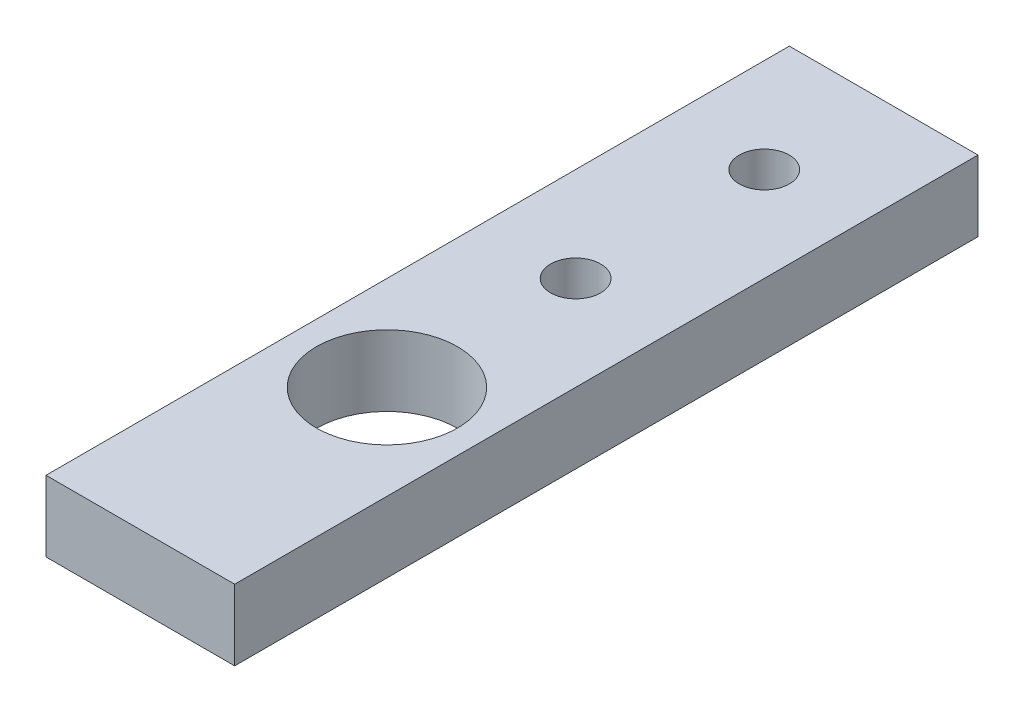
ISO-10303-21;
HEADER;
FILE_DESCRIPTION(('STEP AP214'),'2;1');
FILE_NAME('part.step','',(''),(''),'','','');
FILE_SCHEMA(('AUTOMOTIVE_DESIGN { 1 0 10303 214 1 1 1 1 }'));
ENDSEC;
DATA;
#1=APPLICATION_CONTEXT('core data for automotive mechanical design processes');
#2=APPLICATION_PROTOCOL_DEFINITION('international standard','automotive_design',2000,#1);
#3=PRODUCT_CONTEXT('',#1,'mechanical');
#4=PRODUCT('Part','Part','',(#3));
#5=PRODUCT_RELATED_PRODUCT_CATEGORY('part','',(#4));
#6=PRODUCT_DEFINITION_FORMATION('','',#4);
#7=PRODUCT_DEFINITION_CONTEXT('part definition',#1,'design');
#8=PRODUCT_DEFINITION('design','',#6,#7);
#9=PRODUCT_DEFINITION_SHAPE('','',#8);
#10=(LENGTH_UNIT() NAMED_UNIT(*) SI_UNIT(.MILLI.,.METRE.));
#11=(NAMED_UNIT(*) PLANE_ANGLE_UNIT() SI_UNIT($,.RADIAN.));
#12=(NAMED_UNIT(*) SI_UNIT($,.STERADIAN.) SOLID_ANGLE_UNIT());
#13=UNCERTAINTY_MEASURE_WITH_UNIT(LENGTH_MEASURE(1.E-05),#10,'distance_accuracy_value','');
#14=(GEOMETRIC_REPRESENTATION_CONTEXT(3) GLOBAL_UNCERTAINTY_ASSIGNED_CONTEXT((#13)) GLOBAL_UNIT_ASSIGNED_CONTEXT((#10,
#11,#12)) REPRESENTATION_CONTEXT('',''));
#15=CARTESIAN_POINT('',(0.,0.,0.));
#16=DIRECTION('',(0.,0.,1.));
#17=DIRECTION('',(1.,0.,0.));
#18=AXIS2_PLACEMENT_3D('',#15,#16,#17);
#19=CARTESIAN_POINT('',(-12.7,4.7625,100.076));
#20=DIRECTION('',(1.,0.,0.));
#21=DIRECTION('',(0.,1.,0.));
#22=AXIS2_PLACEMENT_3D('',#19,#20,#21);
#23=PLANE('',#22);
#24=DIRECTION('',(0.,-1.,0.));
#25=VECTOR('',#24,1.);
#26=CARTESIAN_POINT('',(-12.7,4.7625,0.));
#27=LINE('',#26,#25);
#28=CARTESIAN_POINT('',(-12.7,4.7625,0.));
#29=VERTEX_POINT('',#28);
#30=CARTESIAN_POINT('',(-12.7,-4.7625,0.));
#31=VERTEX_POINT('',#30);
#32=EDGE_CURVE('E107',#29,#31,#27,.T.);
#33=ORIENTED_EDGE('',*,*,#32,.T.);
#34=DIRECTION('',(0.,0.,-1.));
#35=VECTOR('',#34,1.);
#36=CARTESIAN_POINT('',(-12.7,-4.7625,100.076));
#37=LINE('',#36,#35);
#38=CARTESIAN_POINT('',(-12.7,-4.7625,100.076));
#39=VERTEX_POINT('',#38);
#40=EDGE_CURVE('E11',#39,#31,#37,.T.);
#41=ORIENTED_EDGE('',*,*,#40,.F.);
#42=DIRECTION('',(0.,-1.,0.));
#43=VECTOR('',#42,1.);
#44=CARTESIAN_POINT('',(-12.7,4.7625,100.076));
#45=LINE('',#44,#43);
#46=CARTESIAN_POINT('',(-12.7,4.7625,100.076));
#47=VERTEX_POINT('',#46);
#48=EDGE_CURVE('E91',#47,#39,#45,.T.);
#49=ORIENTED_EDGE('',*,*,#48,.F.);
#50=DIRECTION('',(0.,0.,-1.));
#51=VECTOR('',#50,1.);
#52=CARTESIAN_POINT('',(-12.7,4.7625,100.076));
#53=LINE('',#52,#51);
#54=EDGE_CURVE('E103',#47,#29,#53,.T.);
#55=ORIENTED_EDGE('',*,*,#54,.T.);
#56=EDGE_LOOP('',(#33,#41,#49,#55));
#57=FACE_BOUND('',#56,.T.);
#58=ADVANCED_FACE('F39',(#57),#23,.F.);
#59=CARTESIAN_POINT('',(12.7,-4.7625,100.076));
#60=DIRECTION('',(0.,1.,0.));
#61=DIRECTION('',(-1.,0.,0.));
#62=AXIS2_PLACEMENT_3D('',#59,#60,#61);
#63=PLANE('',#62);
#64=CARTESIAN_POINT('',(0.,-4.7625,16.0734375));
#65=DIRECTION('',(0.,1.,0.));
#66=DIRECTION('',(-1.,0.,0.));
#67=AXIS2_PLACEMENT_3D('',#64,#65,#66);
#68=CIRCLE('',#67,3.3734375);
#69=CARTESIAN_POINT('',(-3.3734375,-4.7625,16.0734375));
#70=VERTEX_POINT('',#69);
#71=EDGE_CURVE('E111',#70,#70,#68,.T.);
#72=ORIENTED_EDGE('',*,*,#71,.T.);
#73=EDGE_LOOP('',(#72));
#74=FACE_BOUND('',#73,.T.);
#75=CARTESIAN_POINT('',(0.,-4.7625,41.4734375));
#76=DIRECTION('',(0.,1.,0.));
#77=DIRECTION('',(-1.,0.,0.));
#78=AXIS2_PLACEMENT_3D('',#75,#76,#77);
#79=CIRCLE('',#78,3.3734375);
#80=CARTESIAN_POINT('',(-3.37343749999999,-4.7625,41.4734375));
#81=VERTEX_POINT('',#80);
#82=EDGE_CURVE('E140',#81,#81,#79,.T.);
#83=ORIENTED_EDGE('',*,*,#82,.T.);
#84=EDGE_LOOP('',(#83));
#85=FACE_BOUND('',#84,.T.);
#86=CARTESIAN_POINT('',(0.,-4.7625,66.8734375));
#87=DIRECTION('',(0.,1.,0.));
#88=DIRECTION('',(-1.,0.,0.));
#89=AXIS2_PLACEMENT_3D('',#86,#87,#88);
#90=CIRCLE('',#89,9.498);
#91=CARTESIAN_POINT('',(-9.49799999999999,-4.7625,66.8734375));
#92=VERTEX_POINT('',#91);
#93=EDGE_CURVE('E132',#92,#92,#90,.T.);
#94=ORIENTED_EDGE('',*,*,#93,.T.);
#95=EDGE_LOOP('',(#94));
#96=FACE_BOUND('',#95,.T.);
#97=DIRECTION('',(1.,0.,0.));
#98=VECTOR('',#97,1.);
#99=CARTESIAN_POINT('',(12.7,-4.7625,0.));
#100=LINE('',#99,#98);
#101=CARTESIAN_POINT('',(12.7,-4.7625,0.));
#102=VERTEX_POINT('',#101);
#103=EDGE_CURVE('E96',#31,#102,#100,.T.);
#104=ORIENTED_EDGE('',*,*,#103,.T.);
#105=DIRECTION('',(0.,0.,-1.));
#106=VECTOR('',#105,1.);
#107=CARTESIAN_POINT('',(12.7,-4.7625,100.076));
#108=LINE('',#107,#106);
#109=CARTESIAN_POINT('',(12.7,-4.7625,100.076));
#110=VERTEX_POINT('',#109);
#111=EDGE_CURVE('E48',#110,#102,#108,.T.);
#112=ORIENTED_EDGE('',*,*,#111,.F.);
#113=DIRECTION('',(1.,0.,0.));
#114=VECTOR('',#113,1.);
#115=CARTESIAN_POINT('',(12.7,-4.7625,100.076));
#116=LINE('',#115,#114);
#117=EDGE_CURVE('E86',#39,#110,#116,.T.);
#118=ORIENTED_EDGE('',*,*,#117,.F.);
#119=ORIENTED_EDGE('',*,*,#40,.T.);
#120=EDGE_LOOP('',(#104,#112,#118,#119));
#121=FACE_BOUND('',#120,.T.);
#122=ADVANCED_FACE('F95',(#74,#85,#96,#121),#63,.F.);
#123=CARTESIAN_POINT('',(12.7,4.7625,100.076));
#124=DIRECTION('',(-1.,0.,0.));
#125=DIRECTION('',(0.,-1.,0.));
#126=AXIS2_PLACEMENT_3D('',#123,#124,#125);
#127=PLANE('',#126);
#128=DIRECTION('',(0.,1.,0.));
#129=VECTOR('',#128,1.);
#130=CARTESIAN_POINT('',(12.7,4.7625,0.));
#131=LINE('',#130,#129);
#132=CARTESIAN_POINT('',(12.7,4.7625,0.));
#133=VERTEX_POINT('',#132);
#134=EDGE_CURVE('E73',#102,#133,#131,.T.);
#135=ORIENTED_EDGE('',*,*,#134,.T.);
#136=DIRECTION('',(0.,0.,-1.));
#137=VECTOR('',#136,1.);
#138=CARTESIAN_POINT('',(12.7,4.7625,100.076));
#139=LINE('',#138,#137);
#140=CARTESIAN_POINT('',(12.7,4.7625,100.076));
#141=VERTEX_POINT('',#140);
#142=EDGE_CURVE('E98',#141,#133,#139,.T.);
#143=ORIENTED_EDGE('',*,*,#142,.F.);
#144=DIRECTION('',(0.,1.,0.));
#145=VECTOR('',#144,1.);
#146=CARTESIAN_POINT('',(12.7,4.7625,100.076));
#147=LINE('',#146,#145);
#148=EDGE_CURVE('E89',#110,#141,#147,.T.);
#149=ORIENTED_EDGE('',*,*,#148,.F.);
#150=ORIENTED_EDGE('',*,*,#111,.T.);
#151=EDGE_LOOP('',(#135,#143,#149,#150));
#152=FACE_BOUND('',#151,.T.);
#153=ADVANCED_FACE('F99',(#152),#127,.F.);
#154=CARTESIAN_POINT('',(12.7,4.7625,100.076));
#155=DIRECTION('',(0.,-1.,0.));
#156=DIRECTION('',(1.,0.,0.));
#157=AXIS2_PLACEMENT_3D('',#154,#155,#156);
#158=PLANE('',#157);
#159=CARTESIAN_POINT('',(0.,4.7625,16.0734375));
#160=DIRECTION('',(0.,1.,0.));
#161=DIRECTION('',(-1.,0.,0.));
#162=AXIS2_PLACEMENT_3D('',#159,#160,#161);
#163=CIRCLE('',#162,3.3734375);
#164=CARTESIAN_POINT('',(-3.3734375,4.7625,16.0734375));
#165=VERTEX_POINT('',#164);
#166=EDGE_CURVE('E144',#165,#165,#163,.T.);
#167=ORIENTED_EDGE('',*,*,#166,.F.);
#168=EDGE_LOOP('',(#167));
#169=FACE_BOUND('',#168,.T.);
#170=CARTESIAN_POINT('',(0.,4.7625,41.4734375));
#171=DIRECTION('',(0.,1.,0.));
#172=DIRECTION('',(-1.,0.,0.));
#173=AXIS2_PLACEMENT_3D('',#170,#171,#172);
#174=CIRCLE('',#173,3.3734375);
#175=CARTESIAN_POINT('',(-3.37343749999999,4.7625,41.4734375));
#176=VERTEX_POINT('',#175);
#177=EDGE_CURVE('E136',#176,#176,#174,.T.);
#178=ORIENTED_EDGE('',*,*,#177,.F.);
#179=EDGE_LOOP('',(#178));
#180=FACE_BOUND('',#179,.T.);
#181=CARTESIAN_POINT('',(0.,4.7625,66.8734375));
#182=DIRECTION('',(0.,1.,0.));
#183=DIRECTION('',(-1.,0.,0.));
#184=AXIS2_PLACEMENT_3D('',#181,#182,#183);
#185=CIRCLE('',#184,9.498);
#186=CARTESIAN_POINT('',(-9.49799999999999,4.7625,66.8734375));
#187=VERTEX_POINT('',#186);
#188=EDGE_CURVE('E128',#187,#187,#185,.T.);
#189=ORIENTED_EDGE('',*,*,#188,.F.);
#190=EDGE_LOOP('',(#189));
#191=FACE_BOUND('',#190,.T.);
#192=DIRECTION('',(-1.,0.,0.));
#193=VECTOR('',#192,1.);
#194=CARTESIAN_POINT('',(12.7,4.7625,0.));
#195=LINE('',#194,#193);
#196=EDGE_CURVE('E79',#133,#29,#195,.T.);
#197=ORIENTED_EDGE('',*,*,#196,.T.);
#198=ORIENTED_EDGE('',*,*,#54,.F.);
#199=DIRECTION('',(-1.,0.,0.));
#200=VECTOR('',#199,1.);
#201=CARTESIAN_POINT('',(12.7,4.7625,100.076));
#202=LINE('',#201,#200);
#203=EDGE_CURVE('E56',#141,#47,#202,.T.);
#204=ORIENTED_EDGE('',*,*,#203,.F.);
#205=ORIENTED_EDGE('',*,*,#142,.T.);
#206=EDGE_LOOP('',(#197,#198,#204,#205));
#207=FACE_BOUND('',#206,.T.);
#208=ADVANCED_FACE('F121',(#169,#180,#191,#207),#158,.F.);
#209=CARTESIAN_POINT('',(0.,0.,100.076));
#210=DIRECTION('',(0.,0.,-1.));
#211=DIRECTION('',(-1.,0.,0.));
#212=AXIS2_PLACEMENT_3D('',#209,#210,#211);
#213=PLANE('',#212);
#214=ORIENTED_EDGE('',*,*,#48,.T.);
#215=ORIENTED_EDGE('',*,*,#117,.T.);
#216=ORIENTED_EDGE('',*,*,#148,.T.);
#217=ORIENTED_EDGE('',*,*,#203,.T.);
#218=EDGE_LOOP('',(#214,#215,#216,#217));
#219=FACE_BOUND('',#218,.T.);
#220=ADVANCED_FACE('F87',(#219),#213,.F.);
#221=CARTESIAN_POINT('',(0.,0.,0.));
#222=DIRECTION('',(0.,0.,-1.));
#223=DIRECTION('',(-1.,0.,0.));
#224=AXIS2_PLACEMENT_3D('',#221,#222,#223);
#225=PLANE('',#224);
#226=ORIENTED_EDGE('',*,*,#32,.F.);
#227=ORIENTED_EDGE('',*,*,#196,.F.);
#228=ORIENTED_EDGE('',*,*,#134,.F.);
#229=ORIENTED_EDGE('',*,*,#103,.F.);
#230=EDGE_LOOP('',(#226,#227,#228,#229));
#231=FACE_BOUND('',#230,.T.);
#232=ADVANCED_FACE('F124',(#231),#225,.T.);
#233=CARTESIAN_POINT('',(0.,-4.7625,66.8734375));
#234=DIRECTION('',(0.,1.,0.));
#235=DIRECTION('',(-1.,0.,0.));
#236=AXIS2_PLACEMENT_3D('',#233,#234,#235);
#237=CYLINDRICAL_SURFACE('',#236,9.498);
#238=ORIENTED_EDGE('',*,*,#93,.F.);
#239=EDGE_LOOP('',(#238));
#240=FACE_BOUND('',#239,.T.);
#241=ORIENTED_EDGE('',*,*,#188,.T.);
#242=EDGE_LOOP('',(#241));
#243=FACE_BOUND('',#242,.T.);
#244=ADVANCED_FACE('F168',(#240,#243),#237,.F.);
#245=CARTESIAN_POINT('',(0.,-4.7625,41.4734375));
#246=DIRECTION('',(0.,1.,0.));
#247=DIRECTION('',(-1.,0.,0.));
#248=AXIS2_PLACEMENT_3D('',#245,#246,#247);
#249=CYLINDRICAL_SURFACE('',#248,3.3734375);
#250=ORIENTED_EDGE('',*,*,#82,.F.);
#251=EDGE_LOOP('',(#250));
#252=FACE_BOUND('',#251,.T.);
#253=ORIENTED_EDGE('',*,*,#177,.T.);
#254=EDGE_LOOP('',(#253));
#255=FACE_BOUND('',#254,.T.);
#256=ADVANCED_FACE('F157',(#252,#255),#249,.F.);
#257=CARTESIAN_POINT('',(0.,-4.7625,16.0734375));
#258=DIRECTION('',(0.,1.,0.));
#259=DIRECTION('',(-1.,0.,0.));
#260=AXIS2_PLACEMENT_3D('',#257,#258,#259);
#261=CYLINDRICAL_SURFACE('',#260,3.3734375);
#262=ORIENTED_EDGE('',*,*,#71,.F.);
#263=EDGE_LOOP('',(#262));
#264=FACE_BOUND('',#263,.T.);
#265=ORIENTED_EDGE('',*,*,#166,.T.);
#266=EDGE_LOOP('',(#265));
#267=FACE_BOUND('',#266,.T.);
#268=ADVANCED_FACE('F154',(#264,#267),#261,.F.);
#269=CLOSED_SHELL('',(#58,#122,#153,#208,#220,#232,#244,#256,#268));
#270=MANIFOLD_SOLID_BREP('B2',#269);
#271=ADVANCED_BREP_SHAPE_REPRESENTATION('',(#18,#270),#14);
#272=SHAPE_DEFINITION_REPRESENTATION(#9,#271);
ENDSEC;
END-ISO-10303-21;
